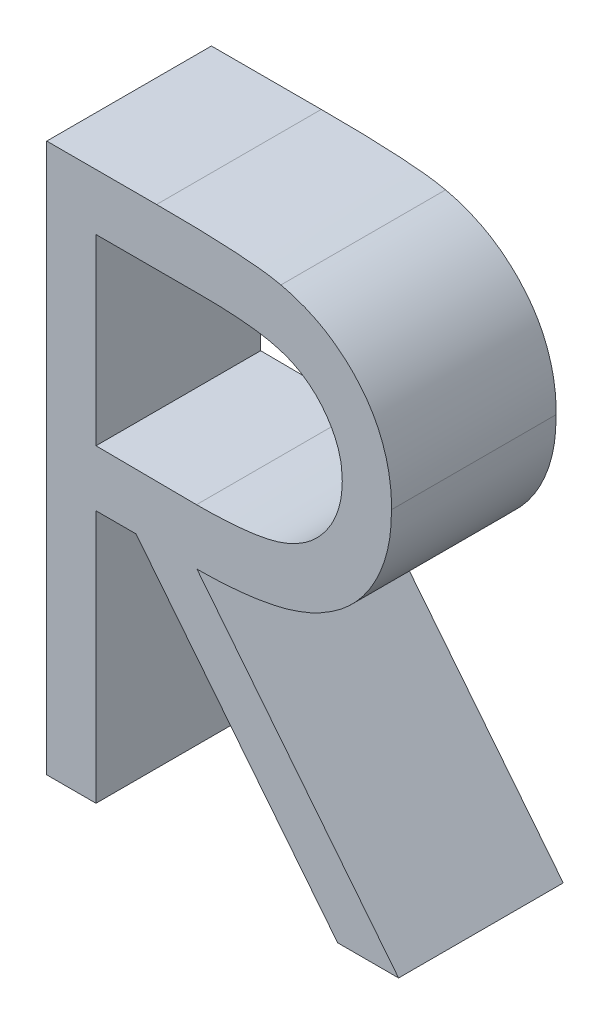
ISO-10303-21;
HEADER;
FILE_DESCRIPTION(('STEP AP214'),'2;1');
FILE_NAME('part.step','',(''),(''),'','','');
FILE_SCHEMA(('AUTOMOTIVE_DESIGN { 1 0 10303 214 1 1 1 1 }'));
ENDSEC;
DATA;
#1=APPLICATION_CONTEXT('core data for automotive mechanical design processes');
#2=APPLICATION_PROTOCOL_DEFINITION('international standard','automotive_design',2000,#1);
#3=PRODUCT_CONTEXT('',#1,'mechanical');
#4=PRODUCT('Part','Part','',(#3));
#5=PRODUCT_RELATED_PRODUCT_CATEGORY('part','',(#4));
#6=PRODUCT_DEFINITION_FORMATION('','',#4);
#7=PRODUCT_DEFINITION_CONTEXT('part definition',#1,'design');
#8=PRODUCT_DEFINITION('design','',#6,#7);
#9=PRODUCT_DEFINITION_SHAPE('','',#8);
#10=(LENGTH_UNIT() NAMED_UNIT(*) SI_UNIT(.MILLI.,.METRE.));
#11=(NAMED_UNIT(*) PLANE_ANGLE_UNIT() SI_UNIT($,.RADIAN.));
#12=(NAMED_UNIT(*) SI_UNIT($,.STERADIAN.) SOLID_ANGLE_UNIT());
#13=UNCERTAINTY_MEASURE_WITH_UNIT(LENGTH_MEASURE(1.E-05),#10,'distance_accuracy_value','');
#14=(GEOMETRIC_REPRESENTATION_CONTEXT(3) GLOBAL_UNCERTAINTY_ASSIGNED_CONTEXT((#13)) GLOBAL_UNIT_ASSIGNED_CONTEXT((#10,
#11,#12)) REPRESENTATION_CONTEXT('',''));
#15=CARTESIAN_POINT('',(0.,0.,0.));
#16=DIRECTION('',(0.,0.,1.));
#17=DIRECTION('',(1.,0.,0.));
#18=AXIS2_PLACEMENT_3D('',#15,#16,#17);
#19=CARTESIAN_POINT('',(-53.8637450074661,-17.8808238361522,1.5));
#20=DIRECTION('',(0.,0.,1.));
#21=DIRECTION('',(1.,0.,0.));
#22=AXIS2_PLACEMENT_3D('',#19,#20,#21);
#23=PLANE('',#22);
#24=DIRECTION('',(0.,1.,0.));
#25=VECTOR('',#24,1.);
#26=CARTESIAN_POINT('',(-55.4324653258695,-22.8701190762308,1.5));
#27=LINE('',#26,#25);
#28=CARTESIAN_POINT('',(-55.4324653258695,-22.8701190762308,1.5));
#29=VERTEX_POINT('',#28);
#30=CARTESIAN_POINT('',(-55.4324653258695,-17.8701190762308,1.5));
#31=VERTEX_POINT('',#30);
#32=EDGE_CURVE('E318',#29,#31,#27,.T.);
#33=ORIENTED_EDGE('',*,*,#32,.F.);
#34=DIRECTION('',(-1.,0.,0.));
#35=VECTOR('',#34,1.);
#36=CARTESIAN_POINT('',(-54.9837473771516,-22.8701190762308,1.5));
#37=LINE('',#36,#35);
#38=CARTESIAN_POINT('',(-54.9837473771516,-22.8701190762308,1.5));
#39=VERTEX_POINT('',#38);
#40=EDGE_CURVE('E269',#39,#29,#37,.T.);
#41=ORIENTED_EDGE('',*,*,#40,.F.);
#42=DIRECTION('',(0.,-1.,0.));
#43=VECTOR('',#42,1.);
#44=CARTESIAN_POINT('',(-54.9837473771516,-20.5624267685385,1.5));
#45=LINE('',#44,#43);
#46=CARTESIAN_POINT('',(-54.9837473771516,-20.5624267685385,1.5));
#47=VERTEX_POINT('',#46);
#48=EDGE_CURVE('E266',#47,#39,#45,.T.);
#49=ORIENTED_EDGE('',*,*,#48,.F.);
#50=DIRECTION('',(-1.,0.,0.));
#51=VECTOR('',#50,1.);
#52=CARTESIAN_POINT('',(-54.6191640438183,-20.5624267685385,1.5));
#53=LINE('',#52,#51);
#54=CARTESIAN_POINT('',(-54.6191640438183,-20.5624267685385,1.5));
#55=VERTEX_POINT('',#54);
#56=EDGE_CURVE('E263',#55,#47,#53,.T.);
#57=ORIENTED_EDGE('',*,*,#56,.F.);
#58=DIRECTION('',(-0.622788232243937,0.782390450976028,0.));
#59=VECTOR('',#58,1.);
#60=CARTESIAN_POINT('',(-52.7822249412542,-22.8701190762308,1.5));
#61=LINE('',#60,#59);
#62=CARTESIAN_POINT('',(-52.7822249412542,-22.8701190762308,1.5));
#63=VERTEX_POINT('',#62);
#64=EDGE_CURVE('E260',#63,#55,#61,.T.);
#65=ORIENTED_EDGE('',*,*,#64,.F.);
#66=DIRECTION('',(-1.,0.,0.));
#67=VECTOR('',#66,1.);
#68=CARTESIAN_POINT('',(-52.2273371207413,-22.8701190762308,1.5));
#69=LINE('',#68,#67);
#70=CARTESIAN_POINT('',(-52.2273371207413,-22.8701190762308,1.5));
#71=VERTEX_POINT('',#70);
#72=EDGE_CURVE('E257',#71,#63,#69,.T.);
#73=ORIENTED_EDGE('',*,*,#72,.F.);
#74=DIRECTION('',(0.622788232243938,-0.782390450976027,0.));
#75=VECTOR('',#74,1.);
#76=CARTESIAN_POINT('',(-54.0642762233054,-20.5624267685385,1.5));
#77=LINE('',#76,#75);
#78=CARTESIAN_POINT('',(-54.0642762233054,-20.5624267685385,1.5));
#79=VERTEX_POINT('',#78);
#80=EDGE_CURVE('E246',#79,#71,#77,.T.);
#81=ORIENTED_EDGE('',*,*,#80,.F.);
#82=CARTESIAN_POINT('',(-52.2914396848439,-19.2072584993077,1.5));
#83=CARTESIAN_POINT('',(-52.2935382535703,-19.2738800773234,1.5));
#84=CARTESIAN_POINT('',(-52.2976331046984,-19.4038760314492,1.5));
#85=CARTESIAN_POINT('',(-52.3358118242413,-19.5925344334617,1.5));
#86=CARTESIAN_POINT('',(-52.3983497095681,-19.7685191686623,1.5));
#87=CARTESIAN_POINT('',(-52.4845258367242,-19.9316086513987,1.5));
#88=CARTESIAN_POINT('',(-52.5942679448863,-20.0786238590561,1.5));
#89=CARTESIAN_POINT('',(-52.7261605036054,-20.2077530809187,1.5));
#90=CARTESIAN_POINT('',(-52.8802770914478,-20.3158100989056,1.5));
#91=CARTESIAN_POINT('',(-53.0237475427895,-20.3907426770506,1.5));
#92=CARTESIAN_POINT('',(-53.1504821137847,-20.4387325465146,1.5));
#93=CARTESIAN_POINT('',(-53.2548154177676,-20.4724987734561,1.5));
#94=CARTESIAN_POINT('',(-53.3686253856188,-20.4985872952804,1.5));
#95=CARTESIAN_POINT('',(-53.4908215779129,-20.5219589120956,1.5));
#96=CARTESIAN_POINT('',(-53.6219125143302,-20.5396041898263,1.5));
#97=CARTESIAN_POINT('',(-53.7615839991719,-20.5525278962111,1.5));
#98=CARTESIAN_POINT('',(-53.9099356443577,-20.5606051086372,1.5));
#99=CARTESIAN_POINT('',(-54.0118486005765,-20.5618079727643,1.5));
#100=CARTESIAN_POINT('',(-54.0642762233054,-20.5624267685385,1.5));
#101=B_SPLINE_CURVE_WITH_KNOTS('',3,(#82,#83,#84,#85,#86,#87,#88,#89,#90,#91,#92,#93,#94,#95,
#96,#97,#98,#99,#100),.UNSPECIFIED.,.F.,.F.,(4,1,1,1,1,1,1,1,1,1,1,1,1,1,1,1,4),(0.,
0.0787802355821386,0.153720644208584,0.22671353030878,0.299191166065935,0.371189996837667,
0.443006414353408,0.516689173294879,0.593217216623411,0.633872917807843,0.676989142289978,
0.722899506325826,0.771958610506144,0.824211323334835,0.879378650627202,0.937948119330417,1.),.UNSPECIFIED.);
#102=CARTESIAN_POINT('',(-52.2914396848439,-19.2072584993077,1.5));
#103=VERTEX_POINT('',#102);
#104=EDGE_CURVE('E240',#103,#79,#101,.T.);
#105=ORIENTED_EDGE('',*,*,#104,.F.);
#106=CARTESIAN_POINT('',(-53.2990518643311,-17.9382280505898,1.5));
#107=CARTESIAN_POINT('',(-53.262470972707,-17.9472662868263,1.5));
#108=CARTESIAN_POINT('',(-53.190089559176,-17.9651499491862,1.5));
#109=CARTESIAN_POINT('',(-53.085875179119,-18.0029493789343,1.5));
#110=CARTESIAN_POINT('',(-52.9865690020451,-18.0466916998267,1.5));
#111=CARTESIAN_POINT('',(-52.8925835387283,-18.0980684431382,1.5));
#112=CARTESIAN_POINT('',(-52.8043895513135,-18.1574609855276,1.5));
#113=CARTESIAN_POINT('',(-52.7210776787496,-18.2238440175778,1.5));
#114=CARTESIAN_POINT('',(-52.6422698739211,-18.2968543115356,1.5));
#115=CARTESIAN_POINT('',(-52.5711532593777,-18.3783326565394,1.5));
#116=CARTESIAN_POINT('',(-52.5040974712427,-18.4638133846537,1.5));
#117=CARTESIAN_POINT('',(-52.4475422905276,-18.5562473229982,1.5));
#118=CARTESIAN_POINT('',(-52.3987901766383,-18.6529066480325,1.5));
#119=CARTESIAN_POINT('',(-52.3599751523523,-18.7547743876832,1.5));
#120=CARTESIAN_POINT('',(-52.3287209045336,-18.8608626332012,1.5));
#121=CARTESIAN_POINT('',(-52.3066834197179,-18.9721323428115,1.5));
#122=CARTESIAN_POINT('',(-52.2934674373882,-19.0880765929314,1.5));
#123=CARTESIAN_POINT('',(-52.2921219294546,-19.1671593197766,1.5));
#124=CARTESIAN_POINT('',(-52.2914396848439,-19.2072584993077,1.5));
#125=B_SPLINE_CURVE_WITH_KNOTS('',3,(#106,#107,#108,#109,#110,#111,#112,#113,#114,#115,#116,
#117,#118,#119,#120,#121,#122,#123,#124),.UNSPECIFIED.,.F.,.F.,(4,1,1,1,1,1,1,1,1,1,1,1,1,1,1,1,
4),(0.,0.0642168426314335,0.127063765693129,0.18874453834783,0.249132102835042,
0.309452532710627,0.369826676247682,0.430650141838467,0.492351931879469,0.554072106262518,
0.615689783744975,0.676797702506538,0.738439048246942,0.801316910064892,0.865184511711542,
0.931641324419076,1.),.UNSPECIFIED.);
#126=CARTESIAN_POINT('',(-53.2990518643311,-17.9382280505898,1.5));
#127=VERTEX_POINT('',#126);
#128=EDGE_CURVE('E247',#127,#103,#125,.T.);
#129=ORIENTED_EDGE('',*,*,#128,.F.);
#130=CARTESIAN_POINT('',(-54.4318643643311,-17.8701190762308,1.5));
#131=CARTESIAN_POINT('',(-54.3650913235974,-17.870341341928,1.5));
#132=CARTESIAN_POINT('',(-54.2368796887273,-17.8707681166877,1.5));
#133=CARTESIAN_POINT('',(-54.0532035882135,-17.873147777985,1.5));
#134=CARTESIAN_POINT('',(-53.8863077353561,-17.8799682861397,1.5));
#135=CARTESIAN_POINT('',(-53.7362793934745,-17.885837691107,1.5));
#136=CARTESIAN_POINT('',(-53.6031213149369,-17.8965404644258,1.5));
#137=CARTESIAN_POINT('',(-53.486425185297,-17.9067699603112,1.5));
#138=CARTESIAN_POINT('',(-53.386728474581,-17.9201609042811,1.5));
#139=CARTESIAN_POINT('',(-53.3263772584344,-17.9325972228035,1.5));
#140=CARTESIAN_POINT('',(-53.2990518643311,-17.9382280505898,1.5));
#141=B_SPLINE_CURVE_WITH_KNOTS('',3,(#130,#131,#132,#133,#134,#135,#136,#137,#138,#139,#140),
.UNSPECIFIED.,.F.,.F.,(4,1,1,1,1,1,1,1,4),(0.,0.1762577548178,0.338434413880477,
0.484822050787836,0.617157578266332,0.734698360612478,0.837385183832359,0.926372420929589,1.),.UNSPECIFIED.);
#142=CARTESIAN_POINT('',(-54.4318643643311,-17.8701190762308,1.5));
#143=VERTEX_POINT('',#142);
#144=EDGE_CURVE('E352',#143,#127,#141,.T.);
#145=ORIENTED_EDGE('',*,*,#144,.F.);
#146=DIRECTION('',(1.,0.,0.));
#147=VECTOR('',#146,1.);
#148=CARTESIAN_POINT('',(-55.4324653258695,-17.8701190762308,1.5));
#149=LINE('',#148,#147);
#150=EDGE_CURVE('E350',#31,#143,#149,.T.);
#151=ORIENTED_EDGE('',*,*,#150,.F.);
#152=EDGE_LOOP('',(#33,#41,#49,#57,#65,#73,#81,#105,#129,#145,#151));
#153=FACE_BOUND('',#152,.T.);
#154=DIRECTION('',(0.,-1.,0.));
#155=VECTOR('',#154,1.);
#156=CARTESIAN_POINT('',(-54.9837473771516,-18.3829395890513,1.5));
#157=LINE('',#156,#155);
#158=CARTESIAN_POINT('',(-54.9837473771516,-18.3829395890513,1.5));
#159=VERTEX_POINT('',#158);
#160=CARTESIAN_POINT('',(-54.9837473771516,-20.049606255718,1.5));
#161=VERTEX_POINT('',#160);
#162=EDGE_CURVE('E155',#159,#161,#157,.T.);
#163=ORIENTED_EDGE('',*,*,#162,.F.);
#164=DIRECTION('',(-1.,0.,0.));
#165=VECTOR('',#164,1.);
#166=CARTESIAN_POINT('',(-54.0462473771516,-18.3829395890513,1.5));
#167=LINE('',#166,#165);
#168=CARTESIAN_POINT('',(-54.0462473771516,-18.3829395890513,1.5));
#169=VERTEX_POINT('',#168);
#170=EDGE_CURVE('E147',#169,#159,#167,.T.);
#171=ORIENTED_EDGE('',*,*,#170,.F.);
#172=CARTESIAN_POINT('',(-52.7401576335618,-19.2062568967436,1.5));
#173=CARTESIAN_POINT('',(-52.7418749494026,-19.1660475057012,1.5));
#174=CARTESIAN_POINT('',(-52.7452780427644,-19.0863671647318,1.5));
#175=CARTESIAN_POINT('',(-52.7730619978025,-18.969715864321,1.5));
#176=CARTESIAN_POINT('',(-52.8200468283118,-18.859620221277,1.5));
#177=CARTESIAN_POINT('',(-52.8833643110614,-18.7565280998603,1.5));
#178=CARTESIAN_POINT('',(-52.9605059610079,-18.6629484772112,1.5));
#179=CARTESIAN_POINT('',(-53.0509599791431,-18.5828811157004,1.5));
#180=CARTESIAN_POINT('',(-53.1522531150717,-18.5168104518746,1.5));
#181=CARTESIAN_POINT('',(-53.2469262555744,-18.4745899082862,1.5));
#182=CARTESIAN_POINT('',(-53.331546559135,-18.4487044036491,1.5));
#183=CARTESIAN_POINT('',(-53.4050175020506,-18.4304884553476,1.5));
#184=CARTESIAN_POINT('',(-53.4880338987926,-18.4158534997334,1.5));
#185=CARTESIAN_POINT('',(-53.5809988396668,-18.4041276984831,1.5));
#186=CARTESIAN_POINT('',(-53.6835154550737,-18.3940492066992,1.5));
#187=CARTESIAN_POINT('',(-53.7961020994902,-18.3872609514733,1.5));
#188=CARTESIAN_POINT('',(-53.9180117855777,-18.3832411456075,1.5));
#189=CARTESIAN_POINT('',(-54.0025074015655,-18.3830424472067,1.5));
#190=CARTESIAN_POINT('',(-54.0462473771516,-18.3829395890513,1.5));
#191=B_SPLINE_CURVE_WITH_KNOTS('',3,(#172,#173,#174,#175,#176,#177,#178,#179,#180,#181,#182,
#183,#184,#185,#186,#187,#188,#189,#190),.UNSPECIFIED.,.F.,.F.,(4,1,1,1,1,1,1,1,1,1,1,1,1,1,1,1,
4),(0.,0.0688142958243091,0.136364824552215,0.204019353511248,0.273063738624612,
0.342913319561489,0.410965444138958,0.479168766513447,0.549308006509783,0.587651576417652,
0.63064666876279,0.678878785696649,0.731934299229584,0.791111422948049,0.85528318951308,
0.925085938677384,1.),.UNSPECIFIED.);
#192=CARTESIAN_POINT('',(-52.7401576335618,-19.2062568967436,1.5));
#193=VERTEX_POINT('',#192);
#194=EDGE_CURVE('E177',#193,#169,#191,.T.);
#195=ORIENTED_EDGE('',*,*,#194,.F.);
#196=CARTESIAN_POINT('',(-54.0682826335619,-20.0566174736667,1.5));
#197=CARTESIAN_POINT('',(-54.0255397208163,-20.0566363831727,1.5));
#198=CARTESIAN_POINT('',(-53.9426917820743,-20.0566730351809,1.5));
#199=CARTESIAN_POINT('',(-53.8228336894866,-20.0509676405472,1.5));
#200=CARTESIAN_POINT('',(-53.7112335299272,-20.0444771859144,1.5));
#201=CARTESIAN_POINT('',(-53.6083181696952,-20.0345495494334,1.5));
#202=CARTESIAN_POINT('',(-53.5140416335152,-20.0217551612537,1.5));
#203=CARTESIAN_POINT('',(-53.4284510431987,-20.0057508980557,1.5));
#204=CARTESIAN_POINT('',(-53.3514066833462,-19.9871050942744,1.5));
#205=CARTESIAN_POINT('',(-53.2615516284566,-19.9582456288316,1.5));
#206=CARTESIAN_POINT('',(-53.1612137265181,-19.9125227455955,1.5));
#207=CARTESIAN_POINT('',(-53.0521687838366,-19.8460006046033,1.5));
#208=CARTESIAN_POINT('',(-52.9593083013359,-19.762330434364,1.5));
#209=CARTESIAN_POINT('',(-52.8808542123288,-19.6666540686006,1.5));
#210=CARTESIAN_POINT('',(-52.817812167364,-19.5614594274039,1.5));
#211=CARTESIAN_POINT('',(-52.7733663754576,-19.4480074713808,1.5));
#212=CARTESIAN_POINT('',(-52.7451628864689,-19.3291623313699,1.5));
#213=CARTESIAN_POINT('',(-52.7418363929697,-19.2474793201631,1.5));
#214=CARTESIAN_POINT('',(-52.7401576335618,-19.2062568967436,1.5));
#215=B_SPLINE_CURVE_WITH_KNOTS('',3,(#196,#197,#198,#199,#200,#201,#202,#203,#204,#205,#206,
#207,#208,#209,#210,#211,#212,#213,#214),.UNSPECIFIED.,.F.,.F.,(4,1,1,1,1,1,1,1,1,1,1,1,1,1,1,1,
4),(0.,0.0716681496796042,0.138913286274204,0.201184570026558,0.259124428290545,
0.312255041426237,0.36068150962311,0.405086143328643,0.445101658590713,0.518777780488261,
0.589461579033196,0.658462241985717,0.727283218368366,0.796322486904719,0.86317489320788,
0.930949380987857,1.),.UNSPECIFIED.);
#216=CARTESIAN_POINT('',(-54.0682826335618,-20.0566174736667,1.5));
#217=VERTEX_POINT('',#216);
#218=EDGE_CURVE('E170',#217,#193,#215,.T.);
#219=ORIENTED_EDGE('',*,*,#218,.F.);
#220=DIRECTION('',(0.999970673881285,-0.0076584187277575,0.));
#221=VECTOR('',#220,1.);
#222=CARTESIAN_POINT('',(-54.9837473771516,-20.049606255718,1.5));
#223=LINE('',#222,#221);
#224=EDGE_CURVE('E168',#161,#217,#223,.T.);
#225=ORIENTED_EDGE('',*,*,#224,.F.);
#226=EDGE_LOOP('',(#163,#171,#195,#219,#225));
#227=FACE_BOUND('',#226,.T.);
#228=ADVANCED_FACE('F33',(#153,#227),#23,.T.);
#229=CARTESIAN_POINT('',(-53.8637450074661,-17.8808238361522,0.));
#230=DIRECTION('',(0.,0.,1.));
#231=DIRECTION('',(1.,0.,0.));
#232=AXIS2_PLACEMENT_3D('',#229,#230,#231);
#233=PLANE('',#232);
#234=DIRECTION('',(0.,1.,0.));
#235=VECTOR('',#234,1.);
#236=CARTESIAN_POINT('',(-55.4324653258695,-22.8701190762308,0.));
#237=LINE('',#236,#235);
#238=CARTESIAN_POINT('',(-55.4324653258695,-22.8701190762308,0.));
#239=VERTEX_POINT('',#238);
#240=CARTESIAN_POINT('',(-55.4324653258695,-17.8701190762308,0.));
#241=VERTEX_POINT('',#240);
#242=EDGE_CURVE('E163',#239,#241,#237,.T.);
#243=ORIENTED_EDGE('',*,*,#242,.T.);
#244=DIRECTION('',(1.,0.,0.));
#245=VECTOR('',#244,1.);
#246=CARTESIAN_POINT('',(-55.4324653258695,-17.8701190762308,0.));
#247=LINE('',#246,#245);
#248=CARTESIAN_POINT('',(-54.4318643643311,-17.8701190762308,0.));
#249=VERTEX_POINT('',#248);
#250=EDGE_CURVE('E274',#241,#249,#247,.T.);
#251=ORIENTED_EDGE('',*,*,#250,.T.);
#252=CARTESIAN_POINT('',(-54.4318643643311,-17.8701190762308,0.));
#253=CARTESIAN_POINT('',(-54.3650913235974,-17.870341341928,0.));
#254=CARTESIAN_POINT('',(-54.2368796887273,-17.8707681166877,0.));
#255=CARTESIAN_POINT('',(-54.0532035882135,-17.873147777985,0.));
#256=CARTESIAN_POINT('',(-53.8863077353561,-17.8799682861397,0.));
#257=CARTESIAN_POINT('',(-53.7362793934745,-17.885837691107,0.));
#258=CARTESIAN_POINT('',(-53.6031213149369,-17.8965404644258,0.));
#259=CARTESIAN_POINT('',(-53.486425185297,-17.9067699603112,0.));
#260=CARTESIAN_POINT('',(-53.386728474581,-17.9201609042811,0.));
#261=CARTESIAN_POINT('',(-53.3263772584344,-17.9325972228035,0.));
#262=CARTESIAN_POINT('',(-53.2990518643311,-17.9382280505898,0.));
#263=B_SPLINE_CURVE_WITH_KNOTS('',3,(#252,#253,#254,#255,#256,#257,#258,#259,#260,#261,#262),
.UNSPECIFIED.,.F.,.F.,(4,1,1,1,1,1,1,1,4),(0.,0.1762577548178,0.338434413880477,
0.484822050787836,0.617157578266332,0.734698360612478,0.837385183832359,0.926372420929589,1.),.UNSPECIFIED.);
#264=CARTESIAN_POINT('',(-53.2990518643311,-17.9382280505898,0.));
#265=VERTEX_POINT('',#264);
#266=EDGE_CURVE('E277',#249,#265,#263,.T.);
#267=ORIENTED_EDGE('',*,*,#266,.T.);
#268=CARTESIAN_POINT('',(-53.2990518643311,-17.9382280505898,0.));
#269=CARTESIAN_POINT('',(-53.262470972707,-17.9472662868263,0.));
#270=CARTESIAN_POINT('',(-53.190089559176,-17.9651499491862,0.));
#271=CARTESIAN_POINT('',(-53.085875179119,-18.0029493789343,0.));
#272=CARTESIAN_POINT('',(-52.9865690020451,-18.0466916998267,0.));
#273=CARTESIAN_POINT('',(-52.8925835387283,-18.0980684431382,0.));
#274=CARTESIAN_POINT('',(-52.8043895513135,-18.1574609855276,0.));
#275=CARTESIAN_POINT('',(-52.7210776787496,-18.2238440175778,0.));
#276=CARTESIAN_POINT('',(-52.6422698739211,-18.2968543115356,0.));
#277=CARTESIAN_POINT('',(-52.5711532593777,-18.3783326565394,0.));
#278=CARTESIAN_POINT('',(-52.5040974712427,-18.4638133846537,0.));
#279=CARTESIAN_POINT('',(-52.4475422905276,-18.5562473229982,0.));
#280=CARTESIAN_POINT('',(-52.3987901766383,-18.6529066480325,0.));
#281=CARTESIAN_POINT('',(-52.3599751523523,-18.7547743876832,0.));
#282=CARTESIAN_POINT('',(-52.3287209045336,-18.8608626332012,0.));
#283=CARTESIAN_POINT('',(-52.3066834197179,-18.9721323428115,0.));
#284=CARTESIAN_POINT('',(-52.2934674373882,-19.0880765929314,0.));
#285=CARTESIAN_POINT('',(-52.2921219294546,-19.1671593197766,0.));
#286=CARTESIAN_POINT('',(-52.2914396848439,-19.2072584993077,0.));
#287=B_SPLINE_CURVE_WITH_KNOTS('',3,(#268,#269,#270,#271,#272,#273,#274,#275,#276,#277,#278,
#279,#280,#281,#282,#283,#284,#285,#286),.UNSPECIFIED.,.F.,.F.,(4,1,1,1,1,1,1,1,1,1,1,1,1,1,1,1,
4),(0.,0.0642168426314335,0.127063765693129,0.18874453834783,0.249132102835042,
0.309452532710627,0.369826676247682,0.430650141838467,0.492351931879469,0.554072106262518,
0.615689783744975,0.676797702506538,0.738439048246942,0.801316910064892,0.865184511711542,
0.931641324419076,1.),.UNSPECIFIED.);
#288=CARTESIAN_POINT('',(-52.2914396848439,-19.2072584993077,0.));
#289=VERTEX_POINT('',#288);
#290=EDGE_CURVE('E282',#265,#289,#287,.T.);
#291=ORIENTED_EDGE('',*,*,#290,.T.);
#292=CARTESIAN_POINT('',(-52.2914396848439,-19.2072584993077,0.));
#293=CARTESIAN_POINT('',(-52.2935382535703,-19.2738800773234,0.));
#294=CARTESIAN_POINT('',(-52.2976331046984,-19.4038760314492,0.));
#295=CARTESIAN_POINT('',(-52.3358118242413,-19.5925344334617,0.));
#296=CARTESIAN_POINT('',(-52.3983497095681,-19.7685191686623,0.));
#297=CARTESIAN_POINT('',(-52.4845258367242,-19.9316086513987,0.));
#298=CARTESIAN_POINT('',(-52.5942679448863,-20.0786238590561,0.));
#299=CARTESIAN_POINT('',(-52.7261605036054,-20.2077530809187,0.));
#300=CARTESIAN_POINT('',(-52.8802770914478,-20.3158100989056,0.));
#301=CARTESIAN_POINT('',(-53.0237475427895,-20.3907426770506,0.));
#302=CARTESIAN_POINT('',(-53.1504821137847,-20.4387325465146,0.));
#303=CARTESIAN_POINT('',(-53.2548154177676,-20.4724987734561,0.));
#304=CARTESIAN_POINT('',(-53.3686253856188,-20.4985872952804,0.));
#305=CARTESIAN_POINT('',(-53.4908215779129,-20.5219589120956,0.));
#306=CARTESIAN_POINT('',(-53.6219125143302,-20.5396041898263,0.));
#307=CARTESIAN_POINT('',(-53.7615839991719,-20.5525278962111,0.));
#308=CARTESIAN_POINT('',(-53.9099356443577,-20.5606051086372,0.));
#309=CARTESIAN_POINT('',(-54.0118486005765,-20.5618079727643,0.));
#310=CARTESIAN_POINT('',(-54.0642762233054,-20.5624267685385,0.));
#311=B_SPLINE_CURVE_WITH_KNOTS('',3,(#292,#293,#294,#295,#296,#297,#298,#299,#300,#301,#302,
#303,#304,#305,#306,#307,#308,#309,#310),.UNSPECIFIED.,.F.,.F.,(4,1,1,1,1,1,1,1,1,1,1,1,1,1,1,1,
4),(0.,0.0787802355821386,0.153720644208584,0.22671353030878,0.299191166065935,
0.371189996837667,0.443006414353408,0.516689173294879,0.593217216623411,0.633872917807843,
0.676989142289978,0.722899506325826,0.771958610506144,0.824211323334835,0.879378650627202,
0.937948119330417,1.),.UNSPECIFIED.);
#312=CARTESIAN_POINT('',(-54.0642762233054,-20.5624267685385,0.));
#313=VERTEX_POINT('',#312);
#314=EDGE_CURVE('E290',#289,#313,#311,.T.);
#315=ORIENTED_EDGE('',*,*,#314,.T.);
#316=DIRECTION('',(0.622788232243938,-0.782390450976027,0.));
#317=VECTOR('',#316,1.);
#318=CARTESIAN_POINT('',(-54.0642762233054,-20.5624267685385,0.));
#319=LINE('',#318,#317);
#320=CARTESIAN_POINT('',(-52.2273371207413,-22.8701190762308,0.));
#321=VERTEX_POINT('',#320);
#322=EDGE_CURVE('E298',#313,#321,#319,.T.);
#323=ORIENTED_EDGE('',*,*,#322,.T.);
#324=DIRECTION('',(-1.,0.,0.));
#325=VECTOR('',#324,1.);
#326=CARTESIAN_POINT('',(-52.2273371207413,-22.8701190762308,0.));
#327=LINE('',#326,#325);
#328=CARTESIAN_POINT('',(-52.7822249412542,-22.8701190762308,0.));
#329=VERTEX_POINT('',#328);
#330=EDGE_CURVE('E304',#321,#329,#327,.T.);
#331=ORIENTED_EDGE('',*,*,#330,.T.);
#332=DIRECTION('',(-0.622788232243937,0.782390450976028,0.));
#333=VECTOR('',#332,1.);
#334=CARTESIAN_POINT('',(-52.7822249412542,-22.8701190762308,0.));
#335=LINE('',#334,#333);
#336=CARTESIAN_POINT('',(-54.6191640438183,-20.5624267685385,0.));
#337=VERTEX_POINT('',#336);
#338=EDGE_CURVE('E307',#329,#337,#335,.T.);
#339=ORIENTED_EDGE('',*,*,#338,.T.);
#340=DIRECTION('',(-1.,0.,0.));
#341=VECTOR('',#340,1.);
#342=CARTESIAN_POINT('',(-54.6191640438183,-20.5624267685385,0.));
#343=LINE('',#342,#341);
#344=CARTESIAN_POINT('',(-54.9837473771516,-20.5624267685385,0.));
#345=VERTEX_POINT('',#344);
#346=EDGE_CURVE('E310',#337,#345,#343,.T.);
#347=ORIENTED_EDGE('',*,*,#346,.T.);
#348=DIRECTION('',(0.,-1.,0.));
#349=VECTOR('',#348,1.);
#350=CARTESIAN_POINT('',(-54.9837473771516,-20.5624267685385,0.));
#351=LINE('',#350,#349);
#352=CARTESIAN_POINT('',(-54.9837473771516,-22.8701190762308,0.));
#353=VERTEX_POINT('',#352);
#354=EDGE_CURVE('E313',#345,#353,#351,.T.);
#355=ORIENTED_EDGE('',*,*,#354,.T.);
#356=DIRECTION('',(-1.,0.,0.));
#357=VECTOR('',#356,1.);
#358=CARTESIAN_POINT('',(-54.9837473771516,-22.8701190762308,0.));
#359=LINE('',#358,#357);
#360=EDGE_CURVE('E316',#353,#239,#359,.T.);
#361=ORIENTED_EDGE('',*,*,#360,.T.);
#362=EDGE_LOOP('',(#243,#251,#267,#291,#315,#323,#331,#339,#347,#355,#361));
#363=FACE_BOUND('',#362,.T.);
#364=DIRECTION('',(-1.,0.,0.));
#365=VECTOR('',#364,1.);
#366=CARTESIAN_POINT('',(-54.0462473771516,-18.3829395890513,0.));
#367=LINE('',#366,#365);
#368=CARTESIAN_POINT('',(-54.0462473771516,-18.3829395890513,0.));
#369=VERTEX_POINT('',#368);
#370=CARTESIAN_POINT('',(-54.9837473771516,-18.3829395890513,0.));
#371=VERTEX_POINT('',#370);
#372=EDGE_CURVE('E58',#369,#371,#367,.T.);
#373=ORIENTED_EDGE('',*,*,#372,.T.);
#374=DIRECTION('',(0.,-1.,0.));
#375=VECTOR('',#374,1.);
#376=CARTESIAN_POINT('',(-54.9837473771516,-18.3829395890513,0.));
#377=LINE('',#376,#375);
#378=CARTESIAN_POINT('',(-54.9837473771516,-20.049606255718,0.));
#379=VERTEX_POINT('',#378);
#380=EDGE_CURVE('E162',#371,#379,#377,.T.);
#381=ORIENTED_EDGE('',*,*,#380,.T.);
#382=DIRECTION('',(0.999970673881285,-0.0076584187277575,0.));
#383=VECTOR('',#382,1.);
#384=CARTESIAN_POINT('',(-54.9837473771516,-20.049606255718,0.));
#385=LINE('',#384,#383);
#386=CARTESIAN_POINT('',(-54.0682826335618,-20.0566174736667,0.));
#387=VERTEX_POINT('',#386);
#388=EDGE_CURVE('E528',#379,#387,#385,.T.);
#389=ORIENTED_EDGE('',*,*,#388,.T.);
#390=CARTESIAN_POINT('',(-54.0682826335619,-20.0566174736667,0.));
#391=CARTESIAN_POINT('',(-54.0255397208163,-20.0566363831727,0.));
#392=CARTESIAN_POINT('',(-53.9426917820743,-20.0566730351809,0.));
#393=CARTESIAN_POINT('',(-53.8228336894866,-20.0509676405472,0.));
#394=CARTESIAN_POINT('',(-53.7112335299272,-20.0444771859144,0.));
#395=CARTESIAN_POINT('',(-53.6083181696952,-20.0345495494334,0.));
#396=CARTESIAN_POINT('',(-53.5140416335152,-20.0217551612537,0.));
#397=CARTESIAN_POINT('',(-53.4284510431987,-20.0057508980557,0.));
#398=CARTESIAN_POINT('',(-53.3514066833462,-19.9871050942744,0.));
#399=CARTESIAN_POINT('',(-53.2615516284566,-19.9582456288316,0.));
#400=CARTESIAN_POINT('',(-53.1612137265181,-19.9125227455955,0.));
#401=CARTESIAN_POINT('',(-53.0521687838366,-19.8460006046033,0.));
#402=CARTESIAN_POINT('',(-52.9593083013359,-19.762330434364,0.));
#403=CARTESIAN_POINT('',(-52.8808542123288,-19.6666540686006,0.));
#404=CARTESIAN_POINT('',(-52.817812167364,-19.5614594274039,0.));
#405=CARTESIAN_POINT('',(-52.7733663754576,-19.4480074713808,0.));
#406=CARTESIAN_POINT('',(-52.7451628864689,-19.3291623313699,0.));
#407=CARTESIAN_POINT('',(-52.7418363929697,-19.2474793201631,0.));
#408=CARTESIAN_POINT('',(-52.7401576335618,-19.2062568967436,0.));
#409=B_SPLINE_CURVE_WITH_KNOTS('',3,(#390,#391,#392,#393,#394,#395,#396,#397,#398,#399,#400,
#401,#402,#403,#404,#405,#406,#407,#408),.UNSPECIFIED.,.F.,.F.,(4,1,1,1,1,1,1,1,1,1,1,1,1,1,1,1,
4),(0.,0.0716681496796042,0.138913286274204,0.201184570026558,0.259124428290545,
0.312255041426237,0.36068150962311,0.405086143328643,0.445101658590713,0.518777780488261,
0.589461579033196,0.658462241985717,0.727283218368366,0.796322486904719,0.86317489320788,
0.930949380987857,1.),.UNSPECIFIED.);
#410=CARTESIAN_POINT('',(-52.7401576335618,-19.2062568967436,0.));
#411=VERTEX_POINT('',#410);
#412=EDGE_CURVE('E523',#387,#411,#409,.T.);
#413=ORIENTED_EDGE('',*,*,#412,.T.);
#414=CARTESIAN_POINT('',(-52.7401576335618,-19.2062568967436,0.));
#415=CARTESIAN_POINT('',(-52.7418749494026,-19.1660475057012,0.));
#416=CARTESIAN_POINT('',(-52.7452780427644,-19.0863671647318,0.));
#417=CARTESIAN_POINT('',(-52.7730619978025,-18.969715864321,0.));
#418=CARTESIAN_POINT('',(-52.8200468283118,-18.859620221277,0.));
#419=CARTESIAN_POINT('',(-52.8833643110614,-18.7565280998603,0.));
#420=CARTESIAN_POINT('',(-52.9605059610079,-18.6629484772112,0.));
#421=CARTESIAN_POINT('',(-53.0509599791431,-18.5828811157004,0.));
#422=CARTESIAN_POINT('',(-53.1522531150717,-18.5168104518746,0.));
#423=CARTESIAN_POINT('',(-53.2469262555744,-18.4745899082862,0.));
#424=CARTESIAN_POINT('',(-53.331546559135,-18.4487044036491,0.));
#425=CARTESIAN_POINT('',(-53.4050175020506,-18.4304884553476,0.));
#426=CARTESIAN_POINT('',(-53.4880338987926,-18.4158534997334,0.));
#427=CARTESIAN_POINT('',(-53.5809988396668,-18.4041276984831,0.));
#428=CARTESIAN_POINT('',(-53.6835154550737,-18.3940492066992,0.));
#429=CARTESIAN_POINT('',(-53.7961020994902,-18.3872609514733,0.));
#430=CARTESIAN_POINT('',(-53.9180117855777,-18.3832411456075,0.));
#431=CARTESIAN_POINT('',(-54.0025074015655,-18.3830424472067,0.));
#432=CARTESIAN_POINT('',(-54.0462473771516,-18.3829395890513,0.));
#433=B_SPLINE_CURVE_WITH_KNOTS('',3,(#414,#415,#416,#417,#418,#419,#420,#421,#422,#423,#424,
#425,#426,#427,#428,#429,#430,#431,#432),.UNSPECIFIED.,.F.,.F.,(4,1,1,1,1,1,1,1,1,1,1,1,1,1,1,1,
4),(0.,0.0688142958243091,0.136364824552215,0.204019353511248,0.273063738624612,
0.342913319561489,0.410965444138958,0.479168766513447,0.549308006509783,0.587651576417652,
0.63064666876279,0.678878785696649,0.731934299229584,0.791111422948049,0.85528318951308,
0.925085938677384,1.),.UNSPECIFIED.);
#434=EDGE_CURVE('E156',#411,#369,#433,.T.);
#435=ORIENTED_EDGE('',*,*,#434,.T.);
#436=EDGE_LOOP('',(#373,#381,#389,#413,#435));
#437=FACE_BOUND('',#436,.T.);
#438=ADVANCED_FACE('F203',(#363,#437),#233,.F.);
#439=CARTESIAN_POINT('',(-55.4324653258695,-22.8701190762308,1.5));
#440=DIRECTION('',(-1.,0.,0.));
#441=DIRECTION('',(0.,0.,1.));
#442=AXIS2_PLACEMENT_3D('',#439,#440,#441);
#443=PLANE('',#442);
#444=ORIENTED_EDGE('',*,*,#242,.F.);
#445=DIRECTION('',(0.,0.,-1.));
#446=VECTOR('',#445,1.);
#447=CARTESIAN_POINT('',(-55.4324653258695,-22.8701190762308,1.5));
#448=LINE('',#447,#446);
#449=EDGE_CURVE('E11',#29,#239,#448,.T.);
#450=ORIENTED_EDGE('',*,*,#449,.F.);
#451=ORIENTED_EDGE('',*,*,#32,.T.);
#452=DIRECTION('',(0.,0.,-1.));
#453=VECTOR('',#452,1.);
#454=CARTESIAN_POINT('',(-55.4324653258695,-17.8701190762308,1.5));
#455=LINE('',#454,#453);
#456=EDGE_CURVE('E37',#31,#241,#455,.T.);
#457=ORIENTED_EDGE('',*,*,#456,.T.);
#458=EDGE_LOOP('',(#444,#450,#451,#457));
#459=FACE_BOUND('',#458,.T.);
#460=ADVANCED_FACE('F35',(#459),#443,.T.);
#461=CARTESIAN_POINT('',(-54.9837473771516,-22.8701190762308,1.5));
#462=DIRECTION('',(0.,-1.,0.));
#463=DIRECTION('',(0.,0.,-1.));
#464=AXIS2_PLACEMENT_3D('',#461,#462,#463);
#465=PLANE('',#464);
#466=ORIENTED_EDGE('',*,*,#360,.F.);
#467=DIRECTION('',(0.,0.,-1.));
#468=VECTOR('',#467,1.);
#469=CARTESIAN_POINT('',(-54.9837473771516,-22.8701190762308,1.5));
#470=LINE('',#469,#468);
#471=EDGE_CURVE('E42',#39,#353,#470,.T.);
#472=ORIENTED_EDGE('',*,*,#471,.F.);
#473=ORIENTED_EDGE('',*,*,#40,.T.);
#474=ORIENTED_EDGE('',*,*,#449,.T.);
#475=EDGE_LOOP('',(#466,#472,#473,#474));
#476=FACE_BOUND('',#475,.T.);
#477=ADVANCED_FACE('F208',(#476),#465,.T.);
#478=CARTESIAN_POINT('',(-54.9837473771516,-20.5624267685385,1.5));
#479=DIRECTION('',(1.,0.,0.));
#480=DIRECTION('',(0.,0.,-1.));
#481=AXIS2_PLACEMENT_3D('',#478,#479,#480);
#482=PLANE('',#481);
#483=ORIENTED_EDGE('',*,*,#354,.F.);
#484=DIRECTION('',(0.,0.,-1.));
#485=VECTOR('',#484,1.);
#486=CARTESIAN_POINT('',(-54.9837473771516,-20.5624267685385,1.5));
#487=LINE('',#486,#485);
#488=EDGE_CURVE('E321',#47,#345,#487,.T.);
#489=ORIENTED_EDGE('',*,*,#488,.F.);
#490=ORIENTED_EDGE('',*,*,#48,.T.);
#491=ORIENTED_EDGE('',*,*,#471,.T.);
#492=EDGE_LOOP('',(#483,#489,#490,#491));
#493=FACE_BOUND('',#492,.T.);
#494=ADVANCED_FACE('F211',(#493),#482,.T.);
#495=CARTESIAN_POINT('',(-54.6191640438183,-20.5624267685385,1.5));
#496=DIRECTION('',(0.,-1.,0.));
#497=DIRECTION('',(0.,0.,-1.));
#498=AXIS2_PLACEMENT_3D('',#495,#496,#497);
#499=PLANE('',#498);
#500=ORIENTED_EDGE('',*,*,#346,.F.);
#501=DIRECTION('',(0.,0.,-1.));
#502=VECTOR('',#501,1.);
#503=CARTESIAN_POINT('',(-54.6191640438183,-20.5624267685385,1.5));
#504=LINE('',#503,#502);
#505=EDGE_CURVE('E323',#55,#337,#504,.T.);
#506=ORIENTED_EDGE('',*,*,#505,.F.);
#507=ORIENTED_EDGE('',*,*,#56,.T.);
#508=ORIENTED_EDGE('',*,*,#488,.T.);
#509=EDGE_LOOP('',(#500,#506,#507,#508));
#510=FACE_BOUND('',#509,.T.);
#511=ADVANCED_FACE('F215',(#510),#499,.T.);
#512=CARTESIAN_POINT('',(-52.7822249412542,-22.8701190762308,1.5));
#513=DIRECTION('',(-0.782390450976028,-0.622788232243937,0.));
#514=DIRECTION('',(0.622788232243937,-0.782390450976028,0.));
#515=AXIS2_PLACEMENT_3D('',#512,#513,#514);
#516=PLANE('',#515);
#517=ORIENTED_EDGE('',*,*,#338,.F.);
#518=DIRECTION('',(0.,0.,-1.));
#519=VECTOR('',#518,1.);
#520=CARTESIAN_POINT('',(-52.7822249412542,-22.8701190762308,1.5));
#521=LINE('',#520,#519);
#522=EDGE_CURVE('E325',#63,#329,#521,.T.);
#523=ORIENTED_EDGE('',*,*,#522,.F.);
#524=ORIENTED_EDGE('',*,*,#64,.T.);
#525=ORIENTED_EDGE('',*,*,#505,.T.);
#526=EDGE_LOOP('',(#517,#523,#524,#525));
#527=FACE_BOUND('',#526,.T.);
#528=ADVANCED_FACE('F219',(#527),#516,.T.);
#529=CARTESIAN_POINT('',(-52.2273371207413,-22.8701190762308,1.5));
#530=DIRECTION('',(0.,-1.,0.));
#531=DIRECTION('',(0.,0.,-1.));
#532=AXIS2_PLACEMENT_3D('',#529,#530,#531);
#533=PLANE('',#532);
#534=ORIENTED_EDGE('',*,*,#330,.F.);
#535=DIRECTION('',(0.,0.,-1.));
#536=VECTOR('',#535,1.);
#537=CARTESIAN_POINT('',(-52.2273371207413,-22.8701190762308,1.5));
#538=LINE('',#537,#536);
#539=EDGE_CURVE('E327',#71,#321,#538,.T.);
#540=ORIENTED_EDGE('',*,*,#539,.F.);
#541=ORIENTED_EDGE('',*,*,#72,.T.);
#542=ORIENTED_EDGE('',*,*,#522,.T.);
#543=EDGE_LOOP('',(#534,#540,#541,#542));
#544=FACE_BOUND('',#543,.T.);
#545=ADVANCED_FACE('F223',(#544),#533,.T.);
#546=CARTESIAN_POINT('',(-54.0642762233054,-20.5624267685385,1.5));
#547=DIRECTION('',(0.782390450976026,0.622788232243938,0.));
#548=DIRECTION('',(-0.622788232243938,0.782390450976027,0.));
#549=AXIS2_PLACEMENT_3D('',#546,#547,#548);
#550=PLANE('',#549);
#551=ORIENTED_EDGE('',*,*,#322,.F.);
#552=DIRECTION('',(0.,0.,-1.));
#553=VECTOR('',#552,1.);
#554=CARTESIAN_POINT('',(-54.0642762233054,-20.5624267685385,1.5));
#555=LINE('',#554,#553);
#556=EDGE_CURVE('E329',#79,#313,#555,.T.);
#557=ORIENTED_EDGE('',*,*,#556,.F.);
#558=ORIENTED_EDGE('',*,*,#80,.T.);
#559=ORIENTED_EDGE('',*,*,#539,.T.);
#560=EDGE_LOOP('',(#551,#557,#558,#559));
#561=FACE_BOUND('',#560,.T.);
#562=ADVANCED_FACE('F227',(#561),#550,.T.);
#563=DIRECTION('',(0.,0.,-1.));
#564=VECTOR('',#563,1.);
#565=SURFACE_OF_LINEAR_EXTRUSION('',#101,#564);
#566=ORIENTED_EDGE('',*,*,#314,.F.);
#567=DIRECTION('',(0.,0.,-1.));
#568=VECTOR('',#567,1.);
#569=CARTESIAN_POINT('',(-52.2914396848439,-19.2072584993077,1.5));
#570=LINE('',#569,#568);
#571=EDGE_CURVE('E331',#103,#289,#570,.T.);
#572=ORIENTED_EDGE('',*,*,#571,.F.);
#573=ORIENTED_EDGE('',*,*,#104,.T.);
#574=ORIENTED_EDGE('',*,*,#556,.T.);
#575=EDGE_LOOP('',(#566,#572,#573,#574));
#576=FACE_BOUND('',#575,.T.);
#577=ADVANCED_FACE('F231',(#576),#565,.T.);
#578=DIRECTION('',(0.,0.,-1.));
#579=VECTOR('',#578,1.);
#580=SURFACE_OF_LINEAR_EXTRUSION('',#125,#579);
#581=ORIENTED_EDGE('',*,*,#290,.F.);
#582=DIRECTION('',(0.,0.,-1.));
#583=VECTOR('',#582,1.);
#584=CARTESIAN_POINT('',(-53.2990518643311,-17.9382280505898,1.5));
#585=LINE('',#584,#583);
#586=EDGE_CURVE('E333',#127,#265,#585,.T.);
#587=ORIENTED_EDGE('',*,*,#586,.F.);
#588=ORIENTED_EDGE('',*,*,#128,.T.);
#589=ORIENTED_EDGE('',*,*,#571,.T.);
#590=EDGE_LOOP('',(#581,#587,#588,#589));
#591=FACE_BOUND('',#590,.T.);
#592=ADVANCED_FACE('F236',(#591),#580,.T.);
#593=DIRECTION('',(0.,0.,-1.));
#594=VECTOR('',#593,1.);
#595=SURFACE_OF_LINEAR_EXTRUSION('',#141,#594);
#596=ORIENTED_EDGE('',*,*,#266,.F.);
#597=DIRECTION('',(0.,0.,-1.));
#598=VECTOR('',#597,1.);
#599=CARTESIAN_POINT('',(-54.4318643643311,-17.8701190762308,1.5));
#600=LINE('',#599,#598);
#601=EDGE_CURVE('E334',#143,#249,#600,.T.);
#602=ORIENTED_EDGE('',*,*,#601,.F.);
#603=ORIENTED_EDGE('',*,*,#144,.T.);
#604=ORIENTED_EDGE('',*,*,#586,.T.);
#605=EDGE_LOOP('',(#596,#602,#603,#604));
#606=FACE_BOUND('',#605,.T.);
#607=ADVANCED_FACE('F362',(#606),#595,.T.);
#608=CARTESIAN_POINT('',(-55.4324653258695,-17.8701190762308,1.5));
#609=DIRECTION('',(0.,1.,0.));
#610=DIRECTION('',(0.,0.,1.));
#611=AXIS2_PLACEMENT_3D('',#608,#609,#610);
#612=PLANE('',#611);
#613=ORIENTED_EDGE('',*,*,#250,.F.);
#614=ORIENTED_EDGE('',*,*,#456,.F.);
#615=ORIENTED_EDGE('',*,*,#150,.T.);
#616=ORIENTED_EDGE('',*,*,#601,.T.);
#617=EDGE_LOOP('',(#613,#614,#615,#616));
#618=FACE_BOUND('',#617,.T.);
#619=ADVANCED_FACE('F200',(#618),#612,.T.);
#620=CARTESIAN_POINT('',(-54.0462473771516,-18.3829395890513,1.5));
#621=DIRECTION('',(0.,-1.,0.));
#622=DIRECTION('',(0.,0.,-1.));
#623=AXIS2_PLACEMENT_3D('',#620,#621,#622);
#624=PLANE('',#623);
#625=ORIENTED_EDGE('',*,*,#372,.F.);
#626=DIRECTION('',(0.,0.,-1.));
#627=VECTOR('',#626,1.);
#628=CARTESIAN_POINT('',(-54.0462473771516,-18.3829395890513,1.5));
#629=LINE('',#628,#627);
#630=EDGE_CURVE('E151',#169,#369,#629,.T.);
#631=ORIENTED_EDGE('',*,*,#630,.F.);
#632=ORIENTED_EDGE('',*,*,#170,.T.);
#633=DIRECTION('',(0.,0.,-1.));
#634=VECTOR('',#633,1.);
#635=CARTESIAN_POINT('',(-54.9837473771516,-18.3829395890513,1.5));
#636=LINE('',#635,#634);
#637=EDGE_CURVE('E150',#159,#371,#636,.T.);
#638=ORIENTED_EDGE('',*,*,#637,.T.);
#639=EDGE_LOOP('',(#625,#631,#632,#638));
#640=FACE_BOUND('',#639,.T.);
#641=ADVANCED_FACE('F149',(#640),#624,.T.);
#642=CARTESIAN_POINT('',(-54.9837473771516,-18.3829395890513,1.5));
#643=DIRECTION('',(1.,0.,0.));
#644=DIRECTION('',(0.,0.,-1.));
#645=AXIS2_PLACEMENT_3D('',#642,#643,#644);
#646=PLANE('',#645);
#647=ORIENTED_EDGE('',*,*,#380,.F.);
#648=ORIENTED_EDGE('',*,*,#637,.F.);
#649=ORIENTED_EDGE('',*,*,#162,.T.);
#650=DIRECTION('',(0.,0.,-1.));
#651=VECTOR('',#650,1.);
#652=CARTESIAN_POINT('',(-54.9837473771516,-20.049606255718,1.5));
#653=LINE('',#652,#651);
#654=EDGE_CURVE('E164',#161,#379,#653,.T.);
#655=ORIENTED_EDGE('',*,*,#654,.T.);
#656=EDGE_LOOP('',(#647,#648,#649,#655));
#657=FACE_BOUND('',#656,.T.);
#658=ADVANCED_FACE('F159',(#657),#646,.T.);
#659=CARTESIAN_POINT('',(-54.9837473771516,-20.049606255718,1.5));
#660=DIRECTION('',(0.0076584187277575,0.999970673881285,0.));
#661=DIRECTION('',(-0.999970673881285,0.0076584187277575,0.));
#662=AXIS2_PLACEMENT_3D('',#659,#660,#661);
#663=PLANE('',#662);
#664=ORIENTED_EDGE('',*,*,#388,.F.);
#665=ORIENTED_EDGE('',*,*,#654,.F.);
#666=ORIENTED_EDGE('',*,*,#224,.T.);
#667=DIRECTION('',(0.,0.,-1.));
#668=VECTOR('',#667,1.);
#669=CARTESIAN_POINT('',(-54.0682826335618,-20.0566174736667,1.5));
#670=LINE('',#669,#668);
#671=EDGE_CURVE('E546',#217,#387,#670,.T.);
#672=ORIENTED_EDGE('',*,*,#671,.T.);
#673=EDGE_LOOP('',(#664,#665,#666,#672));
#674=FACE_BOUND('',#673,.T.);
#675=ADVANCED_FACE('F191',(#674),#663,.T.);
#676=DIRECTION('',(0.,0.,-1.));
#677=VECTOR('',#676,1.);
#678=SURFACE_OF_LINEAR_EXTRUSION('',#215,#677);
#679=ORIENTED_EDGE('',*,*,#412,.F.);
#680=ORIENTED_EDGE('',*,*,#671,.F.);
#681=ORIENTED_EDGE('',*,*,#218,.T.);
#682=DIRECTION('',(0.,0.,-1.));
#683=VECTOR('',#682,1.);
#684=CARTESIAN_POINT('',(-52.7401576335618,-19.2062568967436,1.5));
#685=LINE('',#684,#683);
#686=EDGE_CURVE('E50',#193,#411,#685,.T.);
#687=ORIENTED_EDGE('',*,*,#686,.T.);
#688=EDGE_LOOP('',(#679,#680,#681,#687));
#689=FACE_BOUND('',#688,.T.);
#690=ADVANCED_FACE('F186',(#689),#678,.T.);
#691=DIRECTION('',(0.,0.,-1.));
#692=VECTOR('',#691,1.);
#693=SURFACE_OF_LINEAR_EXTRUSION('',#191,#692);
#694=ORIENTED_EDGE('',*,*,#434,.F.);
#695=ORIENTED_EDGE('',*,*,#686,.F.);
#696=ORIENTED_EDGE('',*,*,#194,.T.);
#697=ORIENTED_EDGE('',*,*,#630,.T.);
#698=EDGE_LOOP('',(#694,#695,#696,#697));
#699=FACE_BOUND('',#698,.T.);
#700=ADVANCED_FACE('F190',(#699),#693,.T.);
#701=CLOSED_SHELL('',(#228,#438,#460,#477,#494,#511,#528,#545,#562,#577,#592,#607,#619,#641,
#658,#675,#690,#700));
#702=MANIFOLD_SOLID_BREP('B2',#701);
#703=ADVANCED_BREP_SHAPE_REPRESENTATION('',(#18,#702),#14);
#704=SHAPE_DEFINITION_REPRESENTATION(#9,#703);
ENDSEC;
END-ISO-10303-21;
